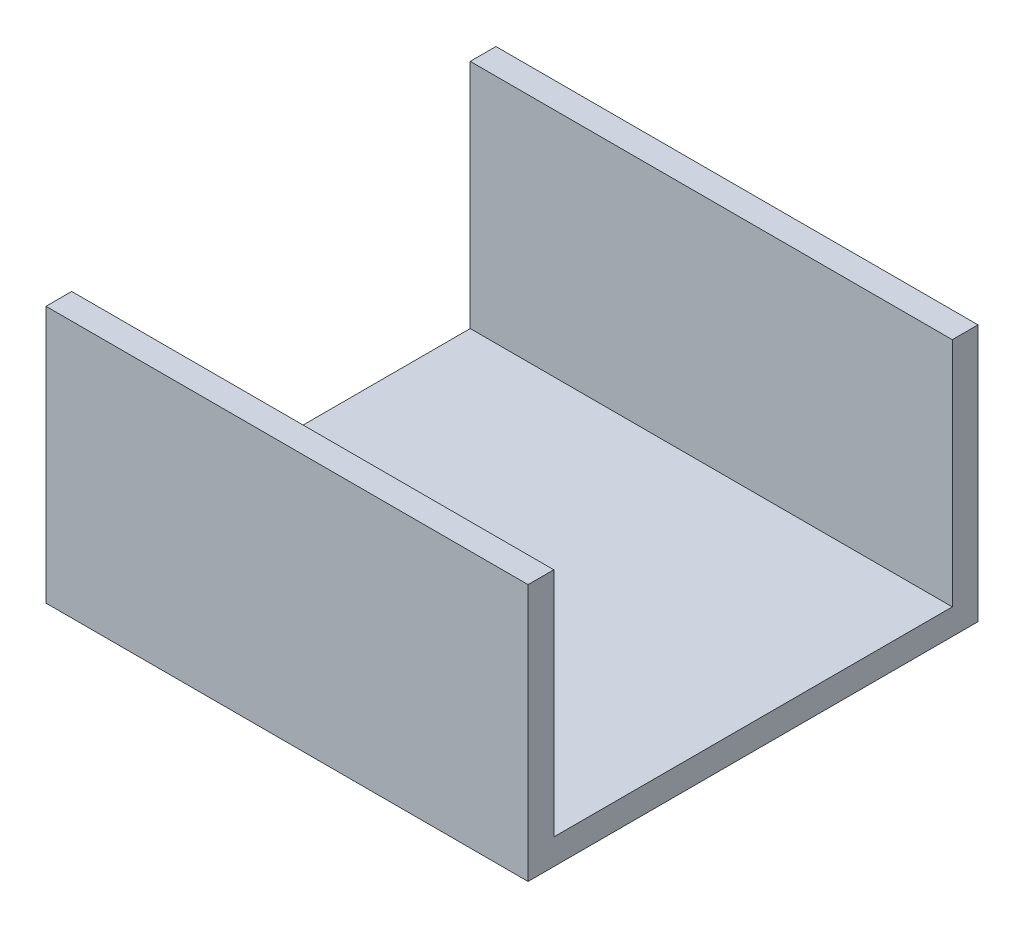
ISO-10303-21;
HEADER;
FILE_DESCRIPTION(('STEP AP214'),'2;1');
FILE_NAME('part.step','',(''),(''),'','','');
FILE_SCHEMA(('AUTOMOTIVE_DESIGN { 1 0 10303 214 1 1 1 1 }'));
ENDSEC;
DATA;
#1=APPLICATION_CONTEXT('core data for automotive mechanical design processes');
#2=APPLICATION_PROTOCOL_DEFINITION('international standard','automotive_design',2000,#1);
#3=PRODUCT_CONTEXT('',#1,'mechanical');
#4=PRODUCT('Part','Part','',(#3));
#5=PRODUCT_RELATED_PRODUCT_CATEGORY('part','',(#4));
#6=PRODUCT_DEFINITION_FORMATION('','',#4);
#7=PRODUCT_DEFINITION_CONTEXT('part definition',#1,'design');
#8=PRODUCT_DEFINITION('design','',#6,#7);
#9=PRODUCT_DEFINITION_SHAPE('','',#8);
#10=(LENGTH_UNIT() NAMED_UNIT(*) SI_UNIT(.MILLI.,.METRE.));
#11=(NAMED_UNIT(*) PLANE_ANGLE_UNIT() SI_UNIT($,.RADIAN.));
#12=(NAMED_UNIT(*) SI_UNIT($,.STERADIAN.) SOLID_ANGLE_UNIT());
#13=UNCERTAINTY_MEASURE_WITH_UNIT(LENGTH_MEASURE(1.E-05),#10,'distance_accuracy_value','');
#14=(GEOMETRIC_REPRESENTATION_CONTEXT(3) GLOBAL_UNCERTAINTY_ASSIGNED_CONTEXT((#13)) GLOBAL_UNIT_ASSIGNED_CONTEXT((#10,
#11,#12)) REPRESENTATION_CONTEXT('',''));
#15=CARTESIAN_POINT('',(0.,0.,0.));
#16=DIRECTION('',(0.,0.,1.));
#17=DIRECTION('',(1.,0.,0.));
#18=AXIS2_PLACEMENT_3D('',#15,#16,#17);
#19=CARTESIAN_POINT('',(0.,4.,0.));
#20=DIRECTION('',(0.,-1.,0.));
#21=DIRECTION('',(0.,0.,-1.));
#22=AXIS2_PLACEMENT_3D('',#19,#20,#21);
#23=PLANE('',#22);
#24=DIRECTION('',(1.,0.,0.));
#25=VECTOR('',#24,1.);
#26=CARTESIAN_POINT('',(75.,4.,-66.));
#27=LINE('',#26,#25);
#28=CARTESIAN_POINT('',(0.,4.,-66.));
#29=VERTEX_POINT('',#28);
#30=CARTESIAN_POINT('',(75.,4.,-66.));
#31=VERTEX_POINT('',#30);
#32=EDGE_CURVE('E58',#29,#31,#27,.T.);
#33=ORIENTED_EDGE('',*,*,#32,.F.);
#34=DIRECTION('',(0.,0.,1.));
#35=VECTOR('',#34,1.);
#36=CARTESIAN_POINT('',(0.,4.,0.));
#37=LINE('',#36,#35);
#38=CARTESIAN_POINT('',(0.,4.,-4.));
#39=VERTEX_POINT('',#38);
#40=EDGE_CURVE('E154',#29,#39,#37,.T.);
#41=ORIENTED_EDGE('',*,*,#40,.T.);
#42=DIRECTION('',(-1.,0.,0.));
#43=VECTOR('',#42,1.);
#44=CARTESIAN_POINT('',(0.,4.,-4.));
#45=LINE('',#44,#43);
#46=CARTESIAN_POINT('',(75.,4.,-4.));
#47=VERTEX_POINT('',#46);
#48=EDGE_CURVE('E130',#47,#39,#45,.T.);
#49=ORIENTED_EDGE('',*,*,#48,.F.);
#50=DIRECTION('',(0.,0.,-1.));
#51=VECTOR('',#50,1.);
#52=CARTESIAN_POINT('',(75.,4.,0.));
#53=LINE('',#52,#51);
#54=EDGE_CURVE('E63',#47,#31,#53,.T.);
#55=ORIENTED_EDGE('',*,*,#54,.T.);
#56=EDGE_LOOP('',(#33,#41,#49,#55));
#57=FACE_BOUND('',#56,.T.);
#58=ADVANCED_FACE('F43',(#57),#23,.F.);
#59=CARTESIAN_POINT('',(0.,4.,0.));
#60=DIRECTION('',(1.,0.,0.));
#61=DIRECTION('',(0.,0.,-1.));
#62=AXIS2_PLACEMENT_3D('',#59,#60,#61);
#63=PLANE('',#62);
#64=DIRECTION('',(0.,0.,1.));
#65=VECTOR('',#64,1.);
#66=CARTESIAN_POINT('',(0.,0.,0.));
#67=LINE('',#66,#65);
#68=CARTESIAN_POINT('',(0.,0.,-70.));
#69=VERTEX_POINT('',#68);
#70=CARTESIAN_POINT('',(0.,0.,0.));
#71=VERTEX_POINT('',#70);
#72=EDGE_CURVE('E153',#69,#71,#67,.T.);
#73=ORIENTED_EDGE('',*,*,#72,.T.);
#74=DIRECTION('',(0.,-1.,0.));
#75=VECTOR('',#74,1.);
#76=CARTESIAN_POINT('',(0.,4.,0.));
#77=LINE('',#76,#75);
#78=CARTESIAN_POINT('',(0.,40.,0.));
#79=VERTEX_POINT('',#78);
#80=EDGE_CURVE('E11',#79,#71,#77,.T.);
#81=ORIENTED_EDGE('',*,*,#80,.F.);
#82=DIRECTION('',(0.,0.,1.));
#83=VECTOR('',#82,1.);
#84=CARTESIAN_POINT('',(0.,40.,0.));
#85=LINE('',#84,#83);
#86=CARTESIAN_POINT('',(0.,40.,-4.));
#87=VERTEX_POINT('',#86);
#88=EDGE_CURVE('E135',#87,#79,#85,.T.);
#89=ORIENTED_EDGE('',*,*,#88,.F.);
#90=DIRECTION('',(0.,-1.,0.));
#91=VECTOR('',#90,1.);
#92=CARTESIAN_POINT('',(0.,40.,-4.));
#93=LINE('',#92,#91);
#94=EDGE_CURVE('E145',#87,#39,#93,.T.);
#95=ORIENTED_EDGE('',*,*,#94,.T.);
#96=ORIENTED_EDGE('',*,*,#40,.F.);
#97=DIRECTION('',(0.,-1.,0.));
#98=VECTOR('',#97,1.);
#99=CARTESIAN_POINT('',(0.,40.,-66.));
#100=LINE('',#99,#98);
#101=CARTESIAN_POINT('',(0.,40.,-66.));
#102=VERTEX_POINT('',#101);
#103=EDGE_CURVE('E122',#102,#29,#100,.T.);
#104=ORIENTED_EDGE('',*,*,#103,.F.);
#105=DIRECTION('',(0.,0.,1.));
#106=VECTOR('',#105,1.);
#107=CARTESIAN_POINT('',(0.,40.,-70.));
#108=LINE('',#107,#106);
#109=CARTESIAN_POINT('',(0.,40.,-70.));
#110=VERTEX_POINT('',#109);
#111=EDGE_CURVE('E113',#110,#102,#108,.T.);
#112=ORIENTED_EDGE('',*,*,#111,.F.);
#113=DIRECTION('',(0.,-1.,0.));
#114=VECTOR('',#113,1.);
#115=CARTESIAN_POINT('',(0.,4.,-70.));
#116=LINE('',#115,#114);
#117=EDGE_CURVE('E158',#110,#69,#116,.T.);
#118=ORIENTED_EDGE('',*,*,#117,.T.);
#119=EDGE_LOOP('',(#73,#81,#89,#95,#96,#104,#112,#118));
#120=FACE_BOUND('',#119,.T.);
#121=ADVANCED_FACE('F45',(#120),#63,.F.);
#122=CARTESIAN_POINT('',(0.,4.,0.));
#123=DIRECTION('',(0.,0.,-1.));
#124=DIRECTION('',(-1.,0.,0.));
#125=AXIS2_PLACEMENT_3D('',#122,#123,#124);
#126=PLANE('',#125);
#127=DIRECTION('',(1.,0.,0.));
#128=VECTOR('',#127,1.);
#129=CARTESIAN_POINT('',(0.,0.,0.));
#130=LINE('',#129,#128);
#131=CARTESIAN_POINT('',(75.,0.,0.));
#132=VERTEX_POINT('',#131);
#133=EDGE_CURVE('E161',#71,#132,#130,.T.);
#134=ORIENTED_EDGE('',*,*,#133,.T.);
#135=DIRECTION('',(0.,-1.,0.));
#136=VECTOR('',#135,1.);
#137=CARTESIAN_POINT('',(75.,4.,0.));
#138=LINE('',#137,#136);
#139=CARTESIAN_POINT('',(75.,40.,0.));
#140=VERTEX_POINT('',#139);
#141=EDGE_CURVE('E51',#140,#132,#138,.T.);
#142=ORIENTED_EDGE('',*,*,#141,.F.);
#143=DIRECTION('',(1.,0.,0.));
#144=VECTOR('',#143,1.);
#145=CARTESIAN_POINT('',(0.,40.,0.));
#146=LINE('',#145,#144);
#147=EDGE_CURVE('E138',#79,#140,#146,.T.);
#148=ORIENTED_EDGE('',*,*,#147,.F.);
#149=ORIENTED_EDGE('',*,*,#80,.T.);
#150=EDGE_LOOP('',(#134,#142,#148,#149));
#151=FACE_BOUND('',#150,.T.);
#152=ADVANCED_FACE('F189',(#151),#126,.F.);
#153=CARTESIAN_POINT('',(75.,4.,0.));
#154=DIRECTION('',(-1.,0.,0.));
#155=DIRECTION('',(0.,0.,1.));
#156=AXIS2_PLACEMENT_3D('',#153,#154,#155);
#157=PLANE('',#156);
#158=DIRECTION('',(0.,0.,-1.));
#159=VECTOR('',#158,1.);
#160=CARTESIAN_POINT('',(75.,0.,0.));
#161=LINE('',#160,#159);
#162=CARTESIAN_POINT('',(75.,0.,-70.));
#163=VERTEX_POINT('',#162);
#164=EDGE_CURVE('E163',#132,#163,#161,.T.);
#165=ORIENTED_EDGE('',*,*,#164,.T.);
#166=DIRECTION('',(0.,-1.,0.));
#167=VECTOR('',#166,1.);
#168=CARTESIAN_POINT('',(75.,4.,-70.));
#169=LINE('',#168,#167);
#170=CARTESIAN_POINT('',(75.,40.,-70.));
#171=VERTEX_POINT('',#170);
#172=EDGE_CURVE('E126',#171,#163,#169,.T.);
#173=ORIENTED_EDGE('',*,*,#172,.F.);
#174=DIRECTION('',(0.,0.,-1.));
#175=VECTOR('',#174,1.);
#176=CARTESIAN_POINT('',(75.,40.,-70.));
#177=LINE('',#176,#175);
#178=CARTESIAN_POINT('',(75.,40.,-66.));
#179=VERTEX_POINT('',#178);
#180=EDGE_CURVE('E111',#179,#171,#177,.T.);
#181=ORIENTED_EDGE('',*,*,#180,.F.);
#182=DIRECTION('',(0.,-1.,0.));
#183=VECTOR('',#182,1.);
#184=CARTESIAN_POINT('',(75.,40.,-66.));
#185=LINE('',#184,#183);
#186=EDGE_CURVE('E117',#179,#31,#185,.T.);
#187=ORIENTED_EDGE('',*,*,#186,.T.);
#188=ORIENTED_EDGE('',*,*,#54,.F.);
#189=DIRECTION('',(0.,-1.,0.));
#190=VECTOR('',#189,1.);
#191=CARTESIAN_POINT('',(75.,40.,-4.));
#192=LINE('',#191,#190);
#193=CARTESIAN_POINT('',(75.,40.,-4.));
#194=VERTEX_POINT('',#193);
#195=EDGE_CURVE('E150',#194,#47,#192,.T.);
#196=ORIENTED_EDGE('',*,*,#195,.F.);
#197=DIRECTION('',(0.,0.,-1.));
#198=VECTOR('',#197,1.);
#199=CARTESIAN_POINT('',(75.,40.,0.));
#200=LINE('',#199,#198);
#201=EDGE_CURVE('E141',#140,#194,#200,.T.);
#202=ORIENTED_EDGE('',*,*,#201,.F.);
#203=ORIENTED_EDGE('',*,*,#141,.T.);
#204=EDGE_LOOP('',(#165,#173,#181,#187,#188,#196,#202,#203));
#205=FACE_BOUND('',#204,.T.);
#206=ADVANCED_FACE('F124',(#205),#157,.F.);
#207=CARTESIAN_POINT('',(0.,4.,-70.));
#208=DIRECTION('',(0.,0.,1.));
#209=DIRECTION('',(1.,0.,0.));
#210=AXIS2_PLACEMENT_3D('',#207,#208,#209);
#211=PLANE('',#210);
#212=DIRECTION('',(-1.,0.,0.));
#213=VECTOR('',#212,1.);
#214=CARTESIAN_POINT('',(0.,0.,-70.));
#215=LINE('',#214,#213);
#216=EDGE_CURVE('E156',#163,#69,#215,.T.);
#217=ORIENTED_EDGE('',*,*,#216,.T.);
#218=ORIENTED_EDGE('',*,*,#117,.F.);
#219=DIRECTION('',(-1.,0.,0.));
#220=VECTOR('',#219,1.);
#221=CARTESIAN_POINT('',(75.,40.,-70.));
#222=LINE('',#221,#220);
#223=EDGE_CURVE('E128',#171,#110,#222,.T.);
#224=ORIENTED_EDGE('',*,*,#223,.F.);
#225=ORIENTED_EDGE('',*,*,#172,.T.);
#226=EDGE_LOOP('',(#217,#218,#224,#225));
#227=FACE_BOUND('',#226,.T.);
#228=ADVANCED_FACE('F179',(#227),#211,.F.);
#229=CARTESIAN_POINT('',(0.,0.,0.));
#230=DIRECTION('',(0.,-1.,0.));
#231=DIRECTION('',(0.,0.,-1.));
#232=AXIS2_PLACEMENT_3D('',#229,#230,#231);
#233=PLANE('',#232);
#234=ORIENTED_EDGE('',*,*,#72,.F.);
#235=ORIENTED_EDGE('',*,*,#216,.F.);
#236=ORIENTED_EDGE('',*,*,#164,.F.);
#237=ORIENTED_EDGE('',*,*,#133,.F.);
#238=EDGE_LOOP('',(#234,#235,#236,#237));
#239=FACE_BOUND('',#238,.T.);
#240=ADVANCED_FACE('F177',(#239),#233,.T.);
#241=CARTESIAN_POINT('',(0.,40.,-4.));
#242=DIRECTION('',(0.,0.,1.));
#243=DIRECTION('',(1.,0.,0.));
#244=AXIS2_PLACEMENT_3D('',#241,#242,#243);
#245=PLANE('',#244);
#246=ORIENTED_EDGE('',*,*,#48,.T.);
#247=ORIENTED_EDGE('',*,*,#94,.F.);
#248=DIRECTION('',(-1.,0.,0.));
#249=VECTOR('',#248,1.);
#250=CARTESIAN_POINT('',(0.,40.,-4.));
#251=LINE('',#250,#249);
#252=EDGE_CURVE('E143',#194,#87,#251,.T.);
#253=ORIENTED_EDGE('',*,*,#252,.F.);
#254=ORIENTED_EDGE('',*,*,#195,.T.);
#255=EDGE_LOOP('',(#246,#247,#253,#254));
#256=FACE_BOUND('',#255,.T.);
#257=ADVANCED_FACE('F185',(#256),#245,.F.);
#258=CARTESIAN_POINT('',(0.,40.,0.));
#259=DIRECTION('',(0.,-1.,0.));
#260=DIRECTION('',(0.,0.,-1.));
#261=AXIS2_PLACEMENT_3D('',#258,#259,#260);
#262=PLANE('',#261);
#263=ORIENTED_EDGE('',*,*,#88,.T.);
#264=ORIENTED_EDGE('',*,*,#147,.T.);
#265=ORIENTED_EDGE('',*,*,#201,.T.);
#266=ORIENTED_EDGE('',*,*,#252,.T.);
#267=EDGE_LOOP('',(#263,#264,#265,#266));
#268=FACE_BOUND('',#267,.T.);
#269=ADVANCED_FACE('F188',(#268),#262,.F.);
#270=CARTESIAN_POINT('',(75.,40.,-66.));
#271=DIRECTION('',(0.,0.,-1.));
#272=DIRECTION('',(-1.,0.,0.));
#273=AXIS2_PLACEMENT_3D('',#270,#271,#272);
#274=PLANE('',#273);
#275=ORIENTED_EDGE('',*,*,#32,.T.);
#276=ORIENTED_EDGE('',*,*,#186,.F.);
#277=DIRECTION('',(1.,0.,0.));
#278=VECTOR('',#277,1.);
#279=CARTESIAN_POINT('',(75.,40.,-66.));
#280=LINE('',#279,#278);
#281=EDGE_CURVE('E106',#102,#179,#280,.T.);
#282=ORIENTED_EDGE('',*,*,#281,.F.);
#283=ORIENTED_EDGE('',*,*,#103,.T.);
#284=EDGE_LOOP('',(#275,#276,#282,#283));
#285=FACE_BOUND('',#284,.T.);
#286=ADVANCED_FACE('F120',(#285),#274,.F.);
#287=CARTESIAN_POINT('',(0.,40.,0.));
#288=DIRECTION('',(0.,-1.,0.));
#289=DIRECTION('',(0.,0.,-1.));
#290=AXIS2_PLACEMENT_3D('',#287,#288,#289);
#291=PLANE('',#290);
#292=ORIENTED_EDGE('',*,*,#180,.T.);
#293=ORIENTED_EDGE('',*,*,#223,.T.);
#294=ORIENTED_EDGE('',*,*,#111,.T.);
#295=ORIENTED_EDGE('',*,*,#281,.T.);
#296=EDGE_LOOP('',(#292,#293,#294,#295));
#297=FACE_BOUND('',#296,.T.);
#298=ADVANCED_FACE('F108',(#297),#291,.F.);
#299=CLOSED_SHELL('',(#58,#121,#152,#206,#228,#240,#257,#269,#286,#298));
#300=MANIFOLD_SOLID_BREP('B2',#299);
#301=ADVANCED_BREP_SHAPE_REPRESENTATION('',(#18,#300),#14);
#302=SHAPE_DEFINITION_REPRESENTATION(#9,#301);
ENDSEC;
END-ISO-10303-21;
